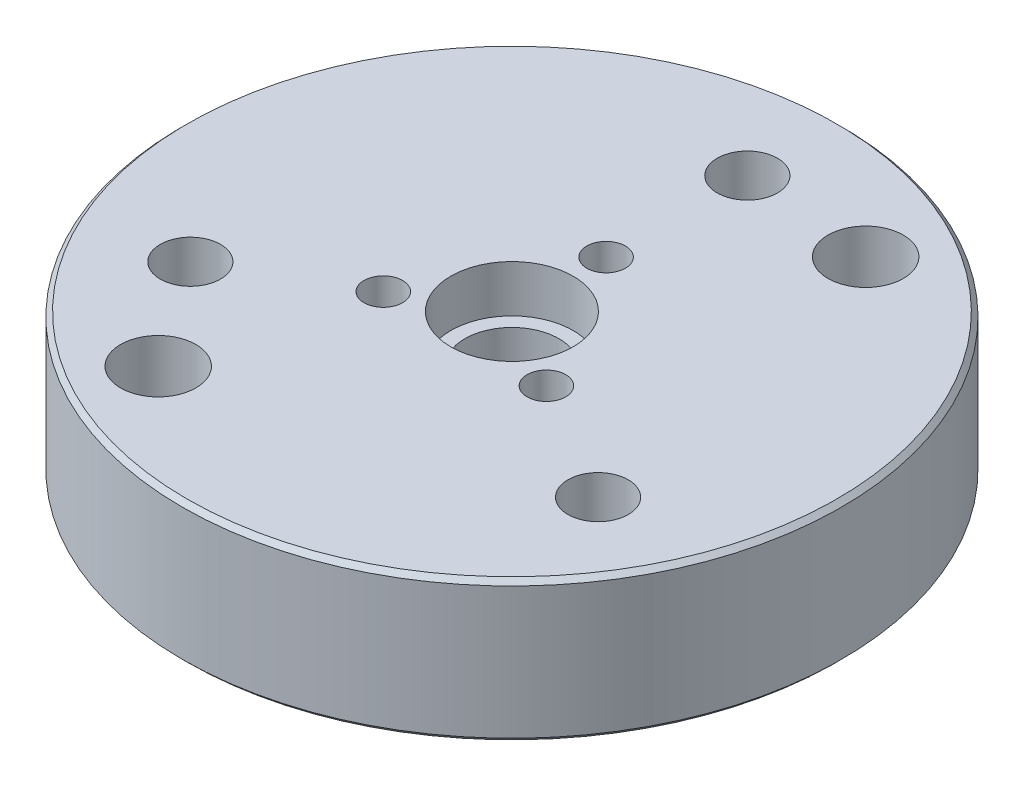
ISO-10303-21;
HEADER;
FILE_DESCRIPTION(('STEP AP214'),'2;1');
FILE_NAME('part.step','',(''),(''),'','','');
FILE_SCHEMA(('AUTOMOTIVE_DESIGN { 1 0 10303 214 1 1 1 1 }'));
ENDSEC;
DATA;
#1=APPLICATION_CONTEXT('core data for automotive mechanical design processes');
#2=APPLICATION_PROTOCOL_DEFINITION('international standard','automotive_design',2000,#1);
#3=PRODUCT_CONTEXT('',#1,'mechanical');
#4=PRODUCT('Part','Part','',(#3));
#5=PRODUCT_RELATED_PRODUCT_CATEGORY('part','',(#4));
#6=PRODUCT_DEFINITION_FORMATION('','',#4);
#7=PRODUCT_DEFINITION_CONTEXT('part definition',#1,'design');
#8=PRODUCT_DEFINITION('design','',#6,#7);
#9=PRODUCT_DEFINITION_SHAPE('','',#8);
#10=(LENGTH_UNIT() NAMED_UNIT(*) SI_UNIT(.MILLI.,.METRE.));
#11=(NAMED_UNIT(*) PLANE_ANGLE_UNIT() SI_UNIT($,.RADIAN.));
#12=(NAMED_UNIT(*) SI_UNIT($,.STERADIAN.) SOLID_ANGLE_UNIT());
#13=UNCERTAINTY_MEASURE_WITH_UNIT(LENGTH_MEASURE(1.E-05),#10,'distance_accuracy_value','');
#14=(GEOMETRIC_REPRESENTATION_CONTEXT(3) GLOBAL_UNCERTAINTY_ASSIGNED_CONTEXT((#13)) GLOBAL_UNIT_ASSIGNED_CONTEXT((#10,
#11,#12)) REPRESENTATION_CONTEXT('',''));
#15=CARTESIAN_POINT('',(0.,0.,0.));
#16=DIRECTION('',(0.,0.,1.));
#17=DIRECTION('',(1.,0.,0.));
#18=AXIS2_PLACEMENT_3D('',#15,#16,#17);
#19=CARTESIAN_POINT('',(0.,-0.000999999999999265,0.));
#20=DIRECTION('',(0.,1.,0.));
#21=DIRECTION('',(0.,0.,1.));
#22=AXIS2_PLACEMENT_3D('',#19,#20,#21);
#23=CYLINDRICAL_SURFACE('',#22,5.);
#24=CARTESIAN_POINT('',(0.,0.,0.));
#25=DIRECTION('',(0.,1.,0.));
#26=DIRECTION('',(0.,0.,1.));
#27=AXIS2_PLACEMENT_3D('',#24,#25,#26);
#28=CIRCLE('',#27,5.);
#29=CARTESIAN_POINT('',(0.,0.,5.));
#30=VERTEX_POINT('',#29);
#31=EDGE_CURVE('E82',#30,#30,#28,.F.);
#32=CARTESIAN_POINT('',(0.,10.,0.));
#33=DIRECTION('',(0.,1.,0.));
#34=DIRECTION('',(0.,0.,1.));
#35=AXIS2_PLACEMENT_3D('',#32,#33,#34);
#36=CIRCLE('',#35,5.);
#37=CARTESIAN_POINT('',(0.,10.,5.));
#38=VERTEX_POINT('',#37);
#39=EDGE_CURVE('E83',#38,#38,#36,.F.);
#40=CARTESIAN_POINT('',(0.,0.,5.));
#41=CARTESIAN_POINT('',(0.,0.104166666666667,5.));
#42=CARTESIAN_POINT('',(0.,0.208333333333333,5.));
#43=CARTESIAN_POINT('',(0.,0.416666666666667,5.));
#44=CARTESIAN_POINT('',(0.,0.520833333333333,5.));
#45=CARTESIAN_POINT('',(0.,0.729166666666667,5.));
#46=CARTESIAN_POINT('',(0.,0.833333333333333,5.));
#47=CARTESIAN_POINT('',(0.,1.04166666666667,5.));
#48=CARTESIAN_POINT('',(0.,1.14583333333333,5.));
#49=CARTESIAN_POINT('',(0.,1.35416666666667,5.));
#50=CARTESIAN_POINT('',(0.,1.45833333333333,5.));
#51=CARTESIAN_POINT('',(0.,1.66666666666667,5.));
#52=CARTESIAN_POINT('',(0.,1.77083333333333,5.));
#53=CARTESIAN_POINT('',(0.,1.97916666666667,5.));
#54=CARTESIAN_POINT('',(0.,2.08333333333333,5.));
#55=CARTESIAN_POINT('',(0.,2.29166666666667,5.));
#56=CARTESIAN_POINT('',(0.,2.39583333333333,5.));
#57=CARTESIAN_POINT('',(0.,2.60416666666667,5.));
#58=CARTESIAN_POINT('',(0.,2.70833333333333,5.));
#59=CARTESIAN_POINT('',(0.,2.91666666666667,5.));
#60=CARTESIAN_POINT('',(0.,3.02083333333333,5.));
#61=CARTESIAN_POINT('',(0.,3.22916666666667,5.));
#62=CARTESIAN_POINT('',(0.,3.33333333333333,5.));
#63=CARTESIAN_POINT('',(0.,3.54166666666667,5.));
#64=CARTESIAN_POINT('',(0.,3.64583333333333,5.));
#65=CARTESIAN_POINT('',(0.,3.85416666666667,5.));
#66=CARTESIAN_POINT('',(0.,3.95833333333333,5.));
#67=CARTESIAN_POINT('',(0.,4.16666666666667,5.));
#68=CARTESIAN_POINT('',(0.,4.27083333333333,5.));
#69=CARTESIAN_POINT('',(0.,4.47916666666667,5.));
#70=CARTESIAN_POINT('',(0.,4.58333333333333,5.));
#71=CARTESIAN_POINT('',(0.,4.79166666666667,5.));
#72=CARTESIAN_POINT('',(0.,4.89583333333333,5.));
#73=CARTESIAN_POINT('',(0.,5.10416666666667,5.));
#74=CARTESIAN_POINT('',(0.,5.20833333333333,5.));
#75=CARTESIAN_POINT('',(0.,5.41666666666667,5.));
#76=CARTESIAN_POINT('',(0.,5.52083333333333,5.));
#77=CARTESIAN_POINT('',(0.,5.72916666666667,5.));
#78=CARTESIAN_POINT('',(0.,5.83333333333333,5.));
#79=CARTESIAN_POINT('',(0.,6.04166666666667,5.));
#80=CARTESIAN_POINT('',(0.,6.14583333333333,5.));
#81=CARTESIAN_POINT('',(0.,6.35416666666667,5.));
#82=CARTESIAN_POINT('',(0.,6.45833333333333,5.));
#83=CARTESIAN_POINT('',(0.,6.66666666666667,5.));
#84=CARTESIAN_POINT('',(0.,6.77083333333333,5.));
#85=CARTESIAN_POINT('',(0.,6.97916666666667,5.));
#86=CARTESIAN_POINT('',(0.,7.08333333333333,5.));
#87=CARTESIAN_POINT('',(0.,7.29166666666667,5.));
#88=CARTESIAN_POINT('',(0.,7.39583333333333,5.));
#89=CARTESIAN_POINT('',(0.,7.60416666666667,5.));
#90=CARTESIAN_POINT('',(0.,7.70833333333333,5.));
#91=CARTESIAN_POINT('',(0.,7.91666666666667,5.));
#92=CARTESIAN_POINT('',(0.,8.02083333333333,5.));
#93=CARTESIAN_POINT('',(0.,8.22916666666667,5.));
#94=CARTESIAN_POINT('',(0.,8.33333333333333,5.));
#95=CARTESIAN_POINT('',(0.,8.54166666666667,5.));
#96=CARTESIAN_POINT('',(0.,8.64583333333333,5.));
#97=CARTESIAN_POINT('',(0.,8.85416666666666,5.));
#98=CARTESIAN_POINT('',(0.,8.95833333333333,5.));
#99=CARTESIAN_POINT('',(0.,9.16666666666666,5.));
#100=CARTESIAN_POINT('',(0.,9.27083333333333,5.));
#101=CARTESIAN_POINT('',(0.,9.47916666666667,5.));
#102=CARTESIAN_POINT('',(0.,9.58333333333333,5.));
#103=CARTESIAN_POINT('',(0.,9.79166666666667,5.));
#104=CARTESIAN_POINT('',(0.,9.89583333333333,5.));
#105=CARTESIAN_POINT('',(0.,10.,5.));
#106=B_SPLINE_CURVE_WITH_KNOTS('',3,(#40,#41,#42,#43,#44,#45,#46,#47,#48,#49,#50,#51,#52,#53,
#54,#55,#56,#57,#58,#59,#60,#61,#62,#63,#64,#65,#66,#67,#68,#69,#70,#71,#72,#73,#74,#75,#76,#77,
#78,#79,#80,#81,#82,#83,#84,#85,#86,#87,#88,#89,#90,#91,#92,#93,#94,#95,#96,#97,#98,#99,#100,
#101,#102,#103,#104,#105),.UNSPECIFIED.,.F.,.F.,(4,2,2,2,2,2,2,2,2,2,2,2,2,2,2,2,2,2,2,2,2,2,2,
2,2,2,2,2,2,2,2,2,4),(0.,0.3125,0.625,0.9375,1.25,1.5625,1.875,2.1875,2.5,2.8125,3.125,3.4375,
3.75,4.0625,4.375,4.6875,5.,5.3125,5.625,5.9375,6.25,6.5625,6.875,7.1875,7.5,7.8125,8.125,
8.4375,8.75,9.0625,9.375,9.6875,10.),.UNSPECIFIED.);
#107=EDGE_CURVE('BSEAM55',#30,#38,#106,.T.);
#108=ORIENTED_EDGE('',*,*,#31,.T.);
#109=ORIENTED_EDGE('',*,*,#39,.F.);
#110=ORIENTED_EDGE('',*,*,#107,.T.);
#111=ORIENTED_EDGE('',*,*,#107,.F.);
#112=EDGE_LOOP('',(#108,#110,#109,#111));
#113=FACE_BOUND('',#112,.T.);
#114=ADVANCED_FACE('F55',(#113),#23,.F.);
#115=CARTESIAN_POINT('',(0.,15.,0.));
#116=DIRECTION('',(0.,-1.,0.));
#117=DIRECTION('',(0.,0.,-1.));
#118=AXIS2_PLACEMENT_3D('',#115,#116,#117);
#119=CYLINDRICAL_SURFACE('',#118,35.);
#120=CARTESIAN_POINT('',(0.,0.500000000000014,0.));
#121=DIRECTION('',(0.,1.,0.));
#122=DIRECTION('',(0.,0.,1.));
#123=AXIS2_PLACEMENT_3D('',#120,#121,#122);
#124=CIRCLE('',#123,35.);
#125=CARTESIAN_POINT('',(0.,0.500000000000014,35.));
#126=VERTEX_POINT('',#125);
#127=EDGE_CURVE('E70',#126,#126,#124,.T.);
#128=ORIENTED_EDGE('',*,*,#127,.T.);
#129=EDGE_LOOP('',(#128));
#130=FACE_BOUND('',#129,.T.);
#131=CARTESIAN_POINT('',(0.,14.5,0.));
#132=DIRECTION('',(0.,1.,0.));
#133=DIRECTION('',(0.,0.,1.));
#134=AXIS2_PLACEMENT_3D('',#131,#132,#133);
#135=CIRCLE('',#134,35.);
#136=CARTESIAN_POINT('',(0.,14.5,35.));
#137=VERTEX_POINT('',#136);
#138=EDGE_CURVE('E76',#137,#137,#135,.F.);
#139=ORIENTED_EDGE('',*,*,#138,.T.);
#140=EDGE_LOOP('',(#139));
#141=FACE_BOUND('',#140,.T.);
#142=ADVANCED_FACE('F190',(#130,#141),#119,.T.);
#143=CARTESIAN_POINT('',(0.,15.,0.));
#144=DIRECTION('',(0.,1.,0.));
#145=DIRECTION('',(0.,0.,1.));
#146=AXIS2_PLACEMENT_3D('',#143,#144,#145);
#147=PLANE('',#146);
#148=CARTESIAN_POINT('',(0.,15.,0.));
#149=DIRECTION('',(0.,1.,0.));
#150=DIRECTION('',(0.,0.,1.));
#151=AXIS2_PLACEMENT_3D('',#148,#149,#150);
#152=CIRCLE('',#151,34.5);
#153=CARTESIAN_POINT('',(0.,15.,34.5));
#154=VERTEX_POINT('',#153);
#155=EDGE_CURVE('E12',#154,#154,#152,.T.);
#156=ORIENTED_EDGE('',*,*,#155,.T.);
#157=EDGE_LOOP('',(#156));
#158=FACE_BOUND('',#157,.T.);
#159=CARTESIAN_POINT('',(13.75,15.,-23.815698604072));
#160=DIRECTION('',(0.,-1.,0.));
#161=DIRECTION('',(0.,0.,-1.));
#162=AXIS2_PLACEMENT_3D('',#159,#160,#161);
#163=CIRCLE('',#162,4.);
#164=CARTESIAN_POINT('',(13.75,15.,-27.815698604072));
#165=VERTEX_POINT('',#164);
#166=EDGE_CURVE('E154',#165,#165,#163,.T.);
#167=ORIENTED_EDGE('',*,*,#166,.T.);
#168=EDGE_LOOP('',(#167));
#169=FACE_BOUND('',#168,.T.);
#170=CARTESIAN_POINT('',(-13.75,15.,23.815698604072));
#171=DIRECTION('',(0.,-1.,0.));
#172=DIRECTION('',(0.,0.,-1.));
#173=AXIS2_PLACEMENT_3D('',#170,#171,#172);
#174=CIRCLE('',#173,4.);
#175=CARTESIAN_POINT('',(-13.75,15.,19.8156986040721));
#176=VERTEX_POINT('',#175);
#177=EDGE_CURVE('E146',#176,#176,#174,.T.);
#178=ORIENTED_EDGE('',*,*,#177,.T.);
#179=EDGE_LOOP('',(#178));
#180=FACE_BOUND('',#179,.T.);
#181=CARTESIAN_POINT('',(0.,15.,-25.));
#182=DIRECTION('',(0.,-1.,0.));
#183=DIRECTION('',(0.,0.,-1.));
#184=AXIS2_PLACEMENT_3D('',#181,#182,#183);
#185=CIRCLE('',#184,3.2);
#186=CARTESIAN_POINT('',(0.,15.,-28.2));
#187=VERTEX_POINT('',#186);
#188=EDGE_CURVE('E138',#187,#187,#185,.T.);
#189=ORIENTED_EDGE('',*,*,#188,.T.);
#190=EDGE_LOOP('',(#189));
#191=FACE_BOUND('',#190,.T.);
#192=CARTESIAN_POINT('',(-21.650635094611,15.,12.4999999999999));
#193=DIRECTION('',(0.,-1.,0.));
#194=DIRECTION('',(0.,0.,-1.));
#195=AXIS2_PLACEMENT_3D('',#192,#193,#194);
#196=CIRCLE('',#195,3.2);
#197=CARTESIAN_POINT('',(-21.650635094611,15.,9.29999999999995));
#198=VERTEX_POINT('',#197);
#199=EDGE_CURVE('E130',#198,#198,#196,.T.);
#200=ORIENTED_EDGE('',*,*,#199,.T.);
#201=EDGE_LOOP('',(#200));
#202=FACE_BOUND('',#201,.T.);
#203=CARTESIAN_POINT('',(21.650635094611,15.,12.5));
#204=DIRECTION('',(0.,-1.,0.));
#205=DIRECTION('',(0.,0.,-1.));
#206=AXIS2_PLACEMENT_3D('',#203,#204,#205);
#207=CIRCLE('',#206,3.2);
#208=CARTESIAN_POINT('',(21.650635094611,15.,9.29999999999996));
#209=VERTEX_POINT('',#208);
#210=EDGE_CURVE('E108',#209,#209,#207,.T.);
#211=ORIENTED_EDGE('',*,*,#210,.T.);
#212=EDGE_LOOP('',(#211));
#213=FACE_BOUND('',#212,.T.);
#214=CARTESIAN_POINT('',(0.,15.,-10.));
#215=DIRECTION('',(0.,1.,0.));
#216=DIRECTION('',(0.,0.,1.));
#217=AXIS2_PLACEMENT_3D('',#214,#215,#216);
#218=CIRCLE('',#217,2.04999999999999);
#219=CARTESIAN_POINT('',(0.,15.,-7.95000000000001));
#220=VERTEX_POINT('',#219);
#221=EDGE_CURVE('E113',#220,#220,#218,.T.);
#222=ORIENTED_EDGE('',*,*,#221,.F.);
#223=EDGE_LOOP('',(#222));
#224=FACE_BOUND('',#223,.T.);
#225=CARTESIAN_POINT('',(8.6602540378444,15.,4.99999999999998));
#226=DIRECTION('',(0.,1.,0.));
#227=DIRECTION('',(0.,0.,1.));
#228=AXIS2_PLACEMENT_3D('',#225,#226,#227);
#229=CIRCLE('',#228,2.04999999999999);
#230=CARTESIAN_POINT('',(8.6602540378444,15.,7.04999999999997));
#231=VERTEX_POINT('',#230);
#232=EDGE_CURVE('E109',#231,#231,#229,.T.);
#233=ORIENTED_EDGE('',*,*,#232,.F.);
#234=EDGE_LOOP('',(#233));
#235=FACE_BOUND('',#234,.T.);
#236=CARTESIAN_POINT('',(-8.6602540378444,15.,4.99999999999998));
#237=DIRECTION('',(0.,1.,0.));
#238=DIRECTION('',(0.,0.,1.));
#239=AXIS2_PLACEMENT_3D('',#236,#237,#238);
#240=CIRCLE('',#239,2.04999999999999);
#241=CARTESIAN_POINT('',(-8.6602540378444,15.,7.04999999999997));
#242=VERTEX_POINT('',#241);
#243=EDGE_CURVE('E99',#242,#242,#240,.T.);
#244=ORIENTED_EDGE('',*,*,#243,.F.);
#245=EDGE_LOOP('',(#244));
#246=FACE_BOUND('',#245,.T.);
#247=CARTESIAN_POINT('',(0.,15.,0.));
#248=DIRECTION('',(0.,1.,0.));
#249=DIRECTION('',(0.,0.,1.));
#250=AXIS2_PLACEMENT_3D('',#247,#248,#249);
#251=CIRCLE('',#250,6.5);
#252=CARTESIAN_POINT('',(0.,15.,6.5));
#253=VERTEX_POINT('',#252);
#254=EDGE_CURVE('E91',#253,#253,#251,.T.);
#255=ORIENTED_EDGE('',*,*,#254,.F.);
#256=EDGE_LOOP('',(#255));
#257=FACE_BOUND('',#256,.T.);
#258=ADVANCED_FACE('F170',(#158,#169,#180,#191,#202,#213,#224,#235,#246,#257),#147,.T.);
#259=CARTESIAN_POINT('',(0.,0.,0.));
#260=DIRECTION('',(0.,1.,0.));
#261=DIRECTION('',(0.,0.,1.));
#262=AXIS2_PLACEMENT_3D('',#259,#260,#261);
#263=PLANE('',#262);
#264=CARTESIAN_POINT('',(0.,0.,0.));
#265=DIRECTION('',(0.,1.,0.));
#266=DIRECTION('',(0.,0.,1.));
#267=AXIS2_PLACEMENT_3D('',#264,#265,#266);
#268=CIRCLE('',#267,34.5);
#269=CARTESIAN_POINT('',(0.,0.,34.5));
#270=VERTEX_POINT('',#269);
#271=EDGE_CURVE('E64',#270,#270,#268,.F.);
#272=ORIENTED_EDGE('',*,*,#271,.T.);
#273=EDGE_LOOP('',(#272));
#274=FACE_BOUND('',#273,.T.);
#275=CARTESIAN_POINT('',(13.75,0.,-23.815698604072));
#276=DIRECTION('',(0.,-1.,0.));
#277=DIRECTION('',(0.,0.,-1.));
#278=AXIS2_PLACEMENT_3D('',#275,#276,#277);
#279=CIRCLE('',#278,4.);
#280=CARTESIAN_POINT('',(13.75,0.,-27.815698604072));
#281=VERTEX_POINT('',#280);
#282=EDGE_CURVE('E158',#281,#281,#279,.T.);
#283=ORIENTED_EDGE('',*,*,#282,.F.);
#284=EDGE_LOOP('',(#283));
#285=FACE_BOUND('',#284,.T.);
#286=CARTESIAN_POINT('',(-13.75,0.,23.815698604072));
#287=DIRECTION('',(0.,-1.,0.));
#288=DIRECTION('',(0.,0.,-1.));
#289=AXIS2_PLACEMENT_3D('',#286,#287,#288);
#290=CIRCLE('',#289,4.);
#291=CARTESIAN_POINT('',(-13.75,0.,19.8156986040721));
#292=VERTEX_POINT('',#291);
#293=EDGE_CURVE('E150',#292,#292,#290,.T.);
#294=ORIENTED_EDGE('',*,*,#293,.F.);
#295=EDGE_LOOP('',(#294));
#296=FACE_BOUND('',#295,.T.);
#297=CARTESIAN_POINT('',(0.,0.,-25.));
#298=DIRECTION('',(0.,-1.,0.));
#299=DIRECTION('',(0.,0.,-1.));
#300=AXIS2_PLACEMENT_3D('',#297,#298,#299);
#301=CIRCLE('',#300,3.2);
#302=CARTESIAN_POINT('',(0.,0.,-28.2));
#303=VERTEX_POINT('',#302);
#304=EDGE_CURVE('E142',#303,#303,#301,.T.);
#305=ORIENTED_EDGE('',*,*,#304,.F.);
#306=EDGE_LOOP('',(#305));
#307=FACE_BOUND('',#306,.T.);
#308=CARTESIAN_POINT('',(-21.650635094611,0.,12.4999999999999));
#309=DIRECTION('',(0.,-1.,0.));
#310=DIRECTION('',(0.,0.,-1.));
#311=AXIS2_PLACEMENT_3D('',#308,#309,#310);
#312=CIRCLE('',#311,3.2);
#313=CARTESIAN_POINT('',(-21.650635094611,0.,9.29999999999995));
#314=VERTEX_POINT('',#313);
#315=EDGE_CURVE('E134',#314,#314,#312,.T.);
#316=ORIENTED_EDGE('',*,*,#315,.F.);
#317=EDGE_LOOP('',(#316));
#318=FACE_BOUND('',#317,.T.);
#319=CARTESIAN_POINT('',(21.650635094611,0.,12.5));
#320=DIRECTION('',(0.,-1.,0.));
#321=DIRECTION('',(0.,0.,-1.));
#322=AXIS2_PLACEMENT_3D('',#319,#320,#321);
#323=CIRCLE('',#322,3.2);
#324=CARTESIAN_POINT('',(21.650635094611,0.,9.29999999999996));
#325=VERTEX_POINT('',#324);
#326=EDGE_CURVE('E126',#325,#325,#323,.T.);
#327=ORIENTED_EDGE('',*,*,#326,.F.);
#328=EDGE_LOOP('',(#327));
#329=FACE_BOUND('',#328,.T.);
#330=CARTESIAN_POINT('',(0.,0.,-10.));
#331=DIRECTION('',(0.,1.,0.));
#332=DIRECTION('',(0.,0.,1.));
#333=AXIS2_PLACEMENT_3D('',#330,#331,#332);
#334=CIRCLE('',#333,2.04999999999999);
#335=CARTESIAN_POINT('',(0.,0.,-7.95000000000001));
#336=VERTEX_POINT('',#335);
#337=EDGE_CURVE('E95',#336,#336,#334,.F.);
#338=ORIENTED_EDGE('',*,*,#337,.F.);
#339=EDGE_LOOP('',(#338));
#340=FACE_BOUND('',#339,.T.);
#341=CARTESIAN_POINT('',(8.6602540378444,0.,4.99999999999998));
#342=DIRECTION('',(0.,1.,0.));
#343=DIRECTION('',(0.,0.,1.));
#344=AXIS2_PLACEMENT_3D('',#341,#342,#343);
#345=CIRCLE('',#344,2.04999999999999);
#346=CARTESIAN_POINT('',(8.6602540378444,0.,7.04999999999997));
#347=VERTEX_POINT('',#346);
#348=EDGE_CURVE('E103',#347,#347,#345,.F.);
#349=ORIENTED_EDGE('',*,*,#348,.F.);
#350=EDGE_LOOP('',(#349));
#351=FACE_BOUND('',#350,.T.);
#352=CARTESIAN_POINT('',(-8.6602540378444,0.,4.99999999999998));
#353=DIRECTION('',(0.,1.,0.));
#354=DIRECTION('',(0.,0.,1.));
#355=AXIS2_PLACEMENT_3D('',#352,#353,#354);
#356=CIRCLE('',#355,2.04999999999999);
#357=CARTESIAN_POINT('',(-8.6602540378444,0.,7.04999999999997));
#358=VERTEX_POINT('',#357);
#359=EDGE_CURVE('E104',#358,#358,#356,.F.);
#360=ORIENTED_EDGE('',*,*,#359,.F.);
#361=EDGE_LOOP('',(#360));
#362=FACE_BOUND('',#361,.T.);
#363=ORIENTED_EDGE('',*,*,#31,.F.);
#364=EDGE_LOOP('',(#363));
#365=FACE_BOUND('',#364,.T.);
#366=ADVANCED_FACE('F166',(#274,#285,#296,#307,#318,#329,#340,#351,#362,#365),#263,.F.);
#367=CARTESIAN_POINT('',(0.,10.,0.));
#368=DIRECTION('',(0.,1.,0.));
#369=DIRECTION('',(0.,0.,1.));
#370=AXIS2_PLACEMENT_3D('',#367,#368,#369);
#371=PLANE('',#370);
#372=CARTESIAN_POINT('',(0.,10.,0.));
#373=DIRECTION('',(0.,1.,0.));
#374=DIRECTION('',(0.,0.,1.));
#375=AXIS2_PLACEMENT_3D('',#372,#373,#374);
#376=CIRCLE('',#375,6.5);
#377=CARTESIAN_POINT('',(0.,10.,6.5));
#378=VERTEX_POINT('',#377);
#379=EDGE_CURVE('E87',#378,#378,#376,.T.);
#380=ORIENTED_EDGE('',*,*,#379,.T.);
#381=EDGE_LOOP('',(#380));
#382=FACE_BOUND('',#381,.T.);
#383=ORIENTED_EDGE('',*,*,#39,.T.);
#384=EDGE_LOOP('',(#383));
#385=FACE_BOUND('',#384,.T.);
#386=ADVANCED_FACE('F169',(#382,#385),#371,.T.);
#387=CARTESIAN_POINT('',(0.,10.,0.));
#388=DIRECTION('',(0.,1.,0.));
#389=DIRECTION('',(0.,0.,1.));
#390=AXIS2_PLACEMENT_3D('',#387,#388,#389);
#391=CYLINDRICAL_SURFACE('',#390,6.5);
#392=ORIENTED_EDGE('',*,*,#379,.F.);
#393=EDGE_LOOP('',(#392));
#394=FACE_BOUND('',#393,.T.);
#395=ORIENTED_EDGE('',*,*,#254,.T.);
#396=EDGE_LOOP('',(#395));
#397=FACE_BOUND('',#396,.T.);
#398=ADVANCED_FACE('F195',(#394,#397),#391,.F.);
#399=CARTESIAN_POINT('',(-8.6602540378444,-0.000999999999999265,4.99999999999998));
#400=DIRECTION('',(0.,1.,0.));
#401=DIRECTION('',(0.,0.,1.));
#402=AXIS2_PLACEMENT_3D('',#399,#400,#401);
#403=CYLINDRICAL_SURFACE('',#402,2.04999999999999);
#404=CARTESIAN_POINT('',(-8.6602540378444,15.,7.04999999999997));
#405=CARTESIAN_POINT('',(-8.6602540378444,14.84375,7.04999999999997));
#406=CARTESIAN_POINT('',(-8.6602540378444,14.6875,7.04999999999997));
#407=CARTESIAN_POINT('',(-8.6602540378444,14.375,7.04999999999997));
#408=CARTESIAN_POINT('',(-8.6602540378444,14.21875,7.04999999999997));
#409=CARTESIAN_POINT('',(-8.6602540378444,13.90625,7.04999999999997));
#410=CARTESIAN_POINT('',(-8.6602540378444,13.75,7.04999999999997));
#411=CARTESIAN_POINT('',(-8.6602540378444,13.4375,7.04999999999997));
#412=CARTESIAN_POINT('',(-8.6602540378444,13.28125,7.04999999999997));
#413=CARTESIAN_POINT('',(-8.6602540378444,12.96875,7.04999999999997));
#414=CARTESIAN_POINT('',(-8.6602540378444,12.8125,7.04999999999997));
#415=CARTESIAN_POINT('',(-8.6602540378444,12.5,7.04999999999997));
#416=CARTESIAN_POINT('',(-8.6602540378444,12.34375,7.04999999999997));
#417=CARTESIAN_POINT('',(-8.6602540378444,12.03125,7.04999999999997));
#418=CARTESIAN_POINT('',(-8.6602540378444,11.875,7.04999999999997));
#419=CARTESIAN_POINT('',(-8.6602540378444,11.5625,7.04999999999997));
#420=CARTESIAN_POINT('',(-8.6602540378444,11.40625,7.04999999999997));
#421=CARTESIAN_POINT('',(-8.6602540378444,11.09375,7.04999999999997));
#422=CARTESIAN_POINT('',(-8.6602540378444,10.9375,7.04999999999997));
#423=CARTESIAN_POINT('',(-8.6602540378444,10.625,7.04999999999997));
#424=CARTESIAN_POINT('',(-8.6602540378444,10.46875,7.04999999999997));
#425=CARTESIAN_POINT('',(-8.6602540378444,10.15625,7.04999999999997));
#426=CARTESIAN_POINT('',(-8.6602540378444,10.,7.04999999999997));
#427=CARTESIAN_POINT('',(-8.6602540378444,9.6875,7.04999999999997));
#428=CARTESIAN_POINT('',(-8.6602540378444,9.53125,7.04999999999997));
#429=CARTESIAN_POINT('',(-8.6602540378444,9.21875,7.04999999999997));
#430=CARTESIAN_POINT('',(-8.6602540378444,9.0625,7.04999999999997));
#431=CARTESIAN_POINT('',(-8.6602540378444,8.75,7.04999999999997));
#432=CARTESIAN_POINT('',(-8.6602540378444,8.59375,7.04999999999997));
#433=CARTESIAN_POINT('',(-8.6602540378444,8.28125,7.04999999999997));
#434=CARTESIAN_POINT('',(-8.6602540378444,8.125,7.04999999999997));
#435=CARTESIAN_POINT('',(-8.6602540378444,7.8125,7.04999999999997));
#436=CARTESIAN_POINT('',(-8.6602540378444,7.65625,7.04999999999997));
#437=CARTESIAN_POINT('',(-8.6602540378444,7.34375,7.04999999999997));
#438=CARTESIAN_POINT('',(-8.6602540378444,7.1875,7.04999999999997));
#439=CARTESIAN_POINT('',(-8.6602540378444,6.875,7.04999999999997));
#440=CARTESIAN_POINT('',(-8.6602540378444,6.71875,7.04999999999997));
#441=CARTESIAN_POINT('',(-8.6602540378444,6.40625,7.04999999999997));
#442=CARTESIAN_POINT('',(-8.6602540378444,6.25,7.04999999999997));
#443=CARTESIAN_POINT('',(-8.6602540378444,5.9375,7.04999999999997));
#444=CARTESIAN_POINT('',(-8.6602540378444,5.78125,7.04999999999997));
#445=CARTESIAN_POINT('',(-8.6602540378444,5.46875,7.04999999999997));
#446=CARTESIAN_POINT('',(-8.6602540378444,5.3125,7.04999999999997));
#447=CARTESIAN_POINT('',(-8.6602540378444,5.,7.04999999999997));
#448=CARTESIAN_POINT('',(-8.6602540378444,4.84375,7.04999999999997));
#449=CARTESIAN_POINT('',(-8.6602540378444,4.53125,7.04999999999997));
#450=CARTESIAN_POINT('',(-8.6602540378444,4.375,7.04999999999997));
#451=CARTESIAN_POINT('',(-8.6602540378444,4.0625,7.04999999999997));
#452=CARTESIAN_POINT('',(-8.6602540378444,3.90625,7.04999999999997));
#453=CARTESIAN_POINT('',(-8.6602540378444,3.59375,7.04999999999997));
#454=CARTESIAN_POINT('',(-8.6602540378444,3.4375,7.04999999999997));
#455=CARTESIAN_POINT('',(-8.6602540378444,3.125,7.04999999999997));
#456=CARTESIAN_POINT('',(-8.6602540378444,2.96875,7.04999999999997));
#457=CARTESIAN_POINT('',(-8.6602540378444,2.65625,7.04999999999997));
#458=CARTESIAN_POINT('',(-8.6602540378444,2.5,7.04999999999997));
#459=CARTESIAN_POINT('',(-8.6602540378444,2.1875,7.04999999999997));
#460=CARTESIAN_POINT('',(-8.6602540378444,2.03125,7.04999999999997));
#461=CARTESIAN_POINT('',(-8.6602540378444,1.71875,7.04999999999997));
#462=CARTESIAN_POINT('',(-8.6602540378444,1.5625,7.04999999999997));
#463=CARTESIAN_POINT('',(-8.6602540378444,1.25,7.04999999999997));
#464=CARTESIAN_POINT('',(-8.6602540378444,1.09375,7.04999999999997));
#465=CARTESIAN_POINT('',(-8.6602540378444,0.781250000000001,7.04999999999997));
#466=CARTESIAN_POINT('',(-8.6602540378444,0.625,7.04999999999997));
#467=CARTESIAN_POINT('',(-8.6602540378444,0.3125,7.04999999999997));
#468=CARTESIAN_POINT('',(-8.6602540378444,0.15625,7.04999999999997));
#469=CARTESIAN_POINT('',(-8.6602540378444,0.,7.04999999999997));
#470=B_SPLINE_CURVE_WITH_KNOTS('',3,(#404,#405,#406,#407,#408,#409,#410,#411,#412,#413,#414,
#415,#416,#417,#418,#419,#420,#421,#422,#423,#424,#425,#426,#427,#428,#429,#430,#431,#432,#433,
#434,#435,#436,#437,#438,#439,#440,#441,#442,#443,#444,#445,#446,#447,#448,#449,#450,#451,#452,
#453,#454,#455,#456,#457,#458,#459,#460,#461,#462,#463,#464,#465,#466,#467,#468,#469),
.UNSPECIFIED.,.F.,.F.,(4,2,2,2,2,2,2,2,2,2,2,2,2,2,2,2,2,2,2,2,2,2,2,2,2,2,2,2,2,2,2,2,4),(0.,
0.46875,0.937500000000001,1.40625,1.875,2.34375,2.8125,3.28125,3.75,4.21875,4.6875,5.15625,
5.625,6.09375,6.5625,7.03125,7.5,7.96875,8.4375,8.90625,9.375,9.84375,10.3125,10.78125,11.25,
11.71875,12.1875,12.65625,13.125,13.59375,14.0625,14.53125,15.),.UNSPECIFIED.);
#471=EDGE_CURVE('BSEAM201',#242,#358,#470,.T.);
#472=ORIENTED_EDGE('',*,*,#243,.T.);
#473=ORIENTED_EDGE('',*,*,#359,.T.);
#474=ORIENTED_EDGE('',*,*,#471,.T.);
#475=ORIENTED_EDGE('',*,*,#471,.F.);
#476=EDGE_LOOP('',(#472,#474,#473,#475));
#477=FACE_BOUND('',#476,.T.);
#478=ADVANCED_FACE('F201',(#477),#403,.F.);
#479=CARTESIAN_POINT('',(8.6602540378444,-0.000999999999999265,4.99999999999998));
#480=DIRECTION('',(0.,1.,0.));
#481=DIRECTION('',(0.,0.,1.));
#482=AXIS2_PLACEMENT_3D('',#479,#480,#481);
#483=CYLINDRICAL_SURFACE('',#482,2.04999999999999);
#484=CARTESIAN_POINT('',(8.6602540378444,15.,7.04999999999997));
#485=CARTESIAN_POINT('',(8.6602540378444,14.84375,7.04999999999997));
#486=CARTESIAN_POINT('',(8.6602540378444,14.6875,7.04999999999997));
#487=CARTESIAN_POINT('',(8.6602540378444,14.375,7.04999999999997));
#488=CARTESIAN_POINT('',(8.6602540378444,14.21875,7.04999999999997));
#489=CARTESIAN_POINT('',(8.6602540378444,13.90625,7.04999999999997));
#490=CARTESIAN_POINT('',(8.6602540378444,13.75,7.04999999999997));
#491=CARTESIAN_POINT('',(8.6602540378444,13.4375,7.04999999999997));
#492=CARTESIAN_POINT('',(8.6602540378444,13.28125,7.04999999999997));
#493=CARTESIAN_POINT('',(8.6602540378444,12.96875,7.04999999999997));
#494=CARTESIAN_POINT('',(8.6602540378444,12.8125,7.04999999999997));
#495=CARTESIAN_POINT('',(8.6602540378444,12.5,7.04999999999997));
#496=CARTESIAN_POINT('',(8.6602540378444,12.34375,7.04999999999997));
#497=CARTESIAN_POINT('',(8.6602540378444,12.03125,7.04999999999997));
#498=CARTESIAN_POINT('',(8.6602540378444,11.875,7.04999999999997));
#499=CARTESIAN_POINT('',(8.6602540378444,11.5625,7.04999999999997));
#500=CARTESIAN_POINT('',(8.6602540378444,11.40625,7.04999999999997));
#501=CARTESIAN_POINT('',(8.6602540378444,11.09375,7.04999999999997));
#502=CARTESIAN_POINT('',(8.6602540378444,10.9375,7.04999999999997));
#503=CARTESIAN_POINT('',(8.6602540378444,10.625,7.04999999999997));
#504=CARTESIAN_POINT('',(8.6602540378444,10.46875,7.04999999999997));
#505=CARTESIAN_POINT('',(8.6602540378444,10.15625,7.04999999999997));
#506=CARTESIAN_POINT('',(8.6602540378444,10.,7.04999999999997));
#507=CARTESIAN_POINT('',(8.6602540378444,9.6875,7.04999999999997));
#508=CARTESIAN_POINT('',(8.6602540378444,9.53125,7.04999999999997));
#509=CARTESIAN_POINT('',(8.6602540378444,9.21875,7.04999999999997));
#510=CARTESIAN_POINT('',(8.6602540378444,9.0625,7.04999999999997));
#511=CARTESIAN_POINT('',(8.6602540378444,8.75,7.04999999999997));
#512=CARTESIAN_POINT('',(8.6602540378444,8.59375,7.04999999999997));
#513=CARTESIAN_POINT('',(8.6602540378444,8.28125,7.04999999999997));
#514=CARTESIAN_POINT('',(8.6602540378444,8.125,7.04999999999997));
#515=CARTESIAN_POINT('',(8.6602540378444,7.8125,7.04999999999997));
#516=CARTESIAN_POINT('',(8.6602540378444,7.65625,7.04999999999997));
#517=CARTESIAN_POINT('',(8.6602540378444,7.34375,7.04999999999997));
#518=CARTESIAN_POINT('',(8.6602540378444,7.1875,7.04999999999997));
#519=CARTESIAN_POINT('',(8.6602540378444,6.875,7.04999999999997));
#520=CARTESIAN_POINT('',(8.6602540378444,6.71875,7.04999999999997));
#521=CARTESIAN_POINT('',(8.6602540378444,6.40625,7.04999999999997));
#522=CARTESIAN_POINT('',(8.6602540378444,6.25,7.04999999999997));
#523=CARTESIAN_POINT('',(8.6602540378444,5.9375,7.04999999999997));
#524=CARTESIAN_POINT('',(8.6602540378444,5.78125,7.04999999999997));
#525=CARTESIAN_POINT('',(8.6602540378444,5.46875,7.04999999999997));
#526=CARTESIAN_POINT('',(8.6602540378444,5.3125,7.04999999999997));
#527=CARTESIAN_POINT('',(8.6602540378444,5.,7.04999999999997));
#528=CARTESIAN_POINT('',(8.6602540378444,4.84375,7.04999999999997));
#529=CARTESIAN_POINT('',(8.6602540378444,4.53125,7.04999999999997));
#530=CARTESIAN_POINT('',(8.6602540378444,4.375,7.04999999999997));
#531=CARTESIAN_POINT('',(8.6602540378444,4.0625,7.04999999999997));
#532=CARTESIAN_POINT('',(8.6602540378444,3.90625,7.04999999999997));
#533=CARTESIAN_POINT('',(8.6602540378444,3.59375,7.04999999999997));
#534=CARTESIAN_POINT('',(8.6602540378444,3.4375,7.04999999999997));
#535=CARTESIAN_POINT('',(8.6602540378444,3.125,7.04999999999997));
#536=CARTESIAN_POINT('',(8.6602540378444,2.96875,7.04999999999997));
#537=CARTESIAN_POINT('',(8.6602540378444,2.65625,7.04999999999997));
#538=CARTESIAN_POINT('',(8.6602540378444,2.5,7.04999999999997));
#539=CARTESIAN_POINT('',(8.6602540378444,2.1875,7.04999999999997));
#540=CARTESIAN_POINT('',(8.6602540378444,2.03125,7.04999999999997));
#541=CARTESIAN_POINT('',(8.6602540378444,1.71875,7.04999999999997));
#542=CARTESIAN_POINT('',(8.6602540378444,1.5625,7.04999999999997));
#543=CARTESIAN_POINT('',(8.6602540378444,1.25,7.04999999999997));
#544=CARTESIAN_POINT('',(8.6602540378444,1.09375,7.04999999999997));
#545=CARTESIAN_POINT('',(8.6602540378444,0.781250000000001,7.04999999999997));
#546=CARTESIAN_POINT('',(8.6602540378444,0.625,7.04999999999997));
#547=CARTESIAN_POINT('',(8.6602540378444,0.3125,7.04999999999997));
#548=CARTESIAN_POINT('',(8.6602540378444,0.15625,7.04999999999997));
#549=CARTESIAN_POINT('',(8.6602540378444,0.,7.04999999999997));
#550=B_SPLINE_CURVE_WITH_KNOTS('',3,(#484,#485,#486,#487,#488,#489,#490,#491,#492,#493,#494,
#495,#496,#497,#498,#499,#500,#501,#502,#503,#504,#505,#506,#507,#508,#509,#510,#511,#512,#513,
#514,#515,#516,#517,#518,#519,#520,#521,#522,#523,#524,#525,#526,#527,#528,#529,#530,#531,#532,
#533,#534,#535,#536,#537,#538,#539,#540,#541,#542,#543,#544,#545,#546,#547,#548,#549),
.UNSPECIFIED.,.F.,.F.,(4,2,2,2,2,2,2,2,2,2,2,2,2,2,2,2,2,2,2,2,2,2,2,2,2,2,2,2,2,2,2,2,4),(0.,
0.46875,0.937500000000001,1.40625,1.875,2.34375,2.8125,3.28125,3.75,4.21875,4.6875,5.15625,
5.625,6.09375,6.5625,7.03125,7.5,7.96875,8.4375,8.90625,9.375,9.84375,10.3125,10.78125,11.25,
11.71875,12.1875,12.65625,13.125,13.59375,14.0625,14.53125,15.),.UNSPECIFIED.);
#551=EDGE_CURVE('BSEAM251',#231,#347,#550,.T.);
#552=ORIENTED_EDGE('',*,*,#232,.T.);
#553=ORIENTED_EDGE('',*,*,#348,.T.);
#554=ORIENTED_EDGE('',*,*,#551,.T.);
#555=ORIENTED_EDGE('',*,*,#551,.F.);
#556=EDGE_LOOP('',(#552,#554,#553,#555));
#557=FACE_BOUND('',#556,.T.);
#558=ADVANCED_FACE('F251',(#557),#483,.F.);
#559=CARTESIAN_POINT('',(0.,-0.000999999999999265,-10.));
#560=DIRECTION('',(0.,1.,0.));
#561=DIRECTION('',(0.,0.,1.));
#562=AXIS2_PLACEMENT_3D('',#559,#560,#561);
#563=CYLINDRICAL_SURFACE('',#562,2.04999999999999);
#564=CARTESIAN_POINT('',(0.,15.,-7.95000000000001));
#565=CARTESIAN_POINT('',(0.,14.84375,-7.95000000000001));
#566=CARTESIAN_POINT('',(0.,14.6875,-7.95000000000001));
#567=CARTESIAN_POINT('',(0.,14.375,-7.95000000000001));
#568=CARTESIAN_POINT('',(0.,14.21875,-7.95000000000001));
#569=CARTESIAN_POINT('',(0.,13.90625,-7.95000000000001));
#570=CARTESIAN_POINT('',(0.,13.75,-7.95000000000001));
#571=CARTESIAN_POINT('',(0.,13.4375,-7.95000000000001));
#572=CARTESIAN_POINT('',(0.,13.28125,-7.95000000000001));
#573=CARTESIAN_POINT('',(0.,12.96875,-7.95000000000001));
#574=CARTESIAN_POINT('',(0.,12.8125,-7.95000000000001));
#575=CARTESIAN_POINT('',(0.,12.5,-7.95000000000001));
#576=CARTESIAN_POINT('',(0.,12.34375,-7.95000000000001));
#577=CARTESIAN_POINT('',(0.,12.03125,-7.95000000000001));
#578=CARTESIAN_POINT('',(0.,11.875,-7.95000000000001));
#579=CARTESIAN_POINT('',(0.,11.5625,-7.95000000000001));
#580=CARTESIAN_POINT('',(0.,11.40625,-7.95000000000001));
#581=CARTESIAN_POINT('',(0.,11.09375,-7.95000000000001));
#582=CARTESIAN_POINT('',(0.,10.9375,-7.95000000000001));
#583=CARTESIAN_POINT('',(0.,10.625,-7.95000000000001));
#584=CARTESIAN_POINT('',(0.,10.46875,-7.95000000000001));
#585=CARTESIAN_POINT('',(0.,10.15625,-7.95000000000001));
#586=CARTESIAN_POINT('',(0.,10.,-7.95000000000001));
#587=CARTESIAN_POINT('',(0.,9.6875,-7.95000000000001));
#588=CARTESIAN_POINT('',(0.,9.53125,-7.95000000000001));
#589=CARTESIAN_POINT('',(0.,9.21875,-7.95000000000001));
#590=CARTESIAN_POINT('',(0.,9.0625,-7.95000000000001));
#591=CARTESIAN_POINT('',(0.,8.75,-7.95000000000001));
#592=CARTESIAN_POINT('',(0.,8.59375,-7.95000000000001));
#593=CARTESIAN_POINT('',(0.,8.28125,-7.95000000000001));
#594=CARTESIAN_POINT('',(0.,8.125,-7.95000000000001));
#595=CARTESIAN_POINT('',(0.,7.8125,-7.95000000000001));
#596=CARTESIAN_POINT('',(0.,7.65625,-7.95000000000001));
#597=CARTESIAN_POINT('',(0.,7.34375,-7.95000000000001));
#598=CARTESIAN_POINT('',(0.,7.1875,-7.95000000000001));
#599=CARTESIAN_POINT('',(0.,6.875,-7.95000000000001));
#600=CARTESIAN_POINT('',(0.,6.71875,-7.95000000000001));
#601=CARTESIAN_POINT('',(0.,6.40625,-7.95000000000001));
#602=CARTESIAN_POINT('',(0.,6.25,-7.95000000000001));
#603=CARTESIAN_POINT('',(0.,5.9375,-7.95000000000001));
#604=CARTESIAN_POINT('',(0.,5.78125,-7.95000000000001));
#605=CARTESIAN_POINT('',(0.,5.46875,-7.95000000000001));
#606=CARTESIAN_POINT('',(0.,5.3125,-7.95000000000001));
#607=CARTESIAN_POINT('',(0.,5.,-7.95000000000001));
#608=CARTESIAN_POINT('',(0.,4.84375,-7.95000000000001));
#609=CARTESIAN_POINT('',(0.,4.53125,-7.95000000000001));
#610=CARTESIAN_POINT('',(0.,4.375,-7.95000000000001));
#611=CARTESIAN_POINT('',(0.,4.0625,-7.95000000000001));
#612=CARTESIAN_POINT('',(0.,3.90625,-7.95000000000001));
#613=CARTESIAN_POINT('',(0.,3.59375,-7.95000000000001));
#614=CARTESIAN_POINT('',(0.,3.4375,-7.95000000000001));
#615=CARTESIAN_POINT('',(0.,3.125,-7.95000000000001));
#616=CARTESIAN_POINT('',(0.,2.96875,-7.95000000000001));
#617=CARTESIAN_POINT('',(0.,2.65625,-7.95000000000001));
#618=CARTESIAN_POINT('',(0.,2.5,-7.95000000000001));
#619=CARTESIAN_POINT('',(0.,2.1875,-7.95000000000001));
#620=CARTESIAN_POINT('',(0.,2.03125,-7.95000000000001));
#621=CARTESIAN_POINT('',(0.,1.71875,-7.95000000000001));
#622=CARTESIAN_POINT('',(0.,1.5625,-7.95000000000001));
#623=CARTESIAN_POINT('',(0.,1.25,-7.95000000000001));
#624=CARTESIAN_POINT('',(0.,1.09375,-7.95000000000001));
#625=CARTESIAN_POINT('',(0.,0.781250000000001,-7.95000000000001));
#626=CARTESIAN_POINT('',(0.,0.625,-7.95000000000001));
#627=CARTESIAN_POINT('',(0.,0.3125,-7.95000000000001));
#628=CARTESIAN_POINT('',(0.,0.15625,-7.95000000000001));
#629=CARTESIAN_POINT('',(0.,0.,-7.95000000000001));
#630=B_SPLINE_CURVE_WITH_KNOTS('',3,(#564,#565,#566,#567,#568,#569,#570,#571,#572,#573,#574,
#575,#576,#577,#578,#579,#580,#581,#582,#583,#584,#585,#586,#587,#588,#589,#590,#591,#592,#593,
#594,#595,#596,#597,#598,#599,#600,#601,#602,#603,#604,#605,#606,#607,#608,#609,#610,#611,#612,
#613,#614,#615,#616,#617,#618,#619,#620,#621,#622,#623,#624,#625,#626,#627,#628,#629),
.UNSPECIFIED.,.F.,.F.,(4,2,2,2,2,2,2,2,2,2,2,2,2,2,2,2,2,2,2,2,2,2,2,2,2,2,2,2,2,2,2,2,4),(0.,
0.46875,0.937500000000001,1.40625,1.875,2.34375,2.8125,3.28125,3.75,4.21875,4.6875,5.15625,
5.625,6.09375,6.5625,7.03125,7.5,7.96875,8.4375,8.90625,9.375,9.84375,10.3125,10.78125,11.25,
11.71875,12.1875,12.65625,13.125,13.59375,14.0625,14.53125,15.),.UNSPECIFIED.);
#631=EDGE_CURVE('BSEAM248',#220,#336,#630,.T.);
#632=ORIENTED_EDGE('',*,*,#221,.T.);
#633=ORIENTED_EDGE('',*,*,#337,.T.);
#634=ORIENTED_EDGE('',*,*,#631,.T.);
#635=ORIENTED_EDGE('',*,*,#631,.F.);
#636=EDGE_LOOP('',(#632,#634,#633,#635));
#637=FACE_BOUND('',#636,.T.);
#638=ADVANCED_FACE('F248',(#637),#563,.F.);
#639=CARTESIAN_POINT('',(21.650635094611,0.,12.5));
#640=DIRECTION('',(0.,-1.,0.));
#641=DIRECTION('',(0.,0.,-1.));
#642=AXIS2_PLACEMENT_3D('',#639,#640,#641);
#643=CYLINDRICAL_SURFACE('',#642,3.2);
#644=ORIENTED_EDGE('',*,*,#210,.F.);
#645=EDGE_LOOP('',(#644));
#646=FACE_BOUND('',#645,.T.);
#647=ORIENTED_EDGE('',*,*,#326,.T.);
#648=EDGE_LOOP('',(#647));
#649=FACE_BOUND('',#648,.T.);
#650=ADVANCED_FACE('F244',(#646,#649),#643,.F.);
#651=CARTESIAN_POINT('',(-21.650635094611,0.,12.4999999999999));
#652=DIRECTION('',(0.,-1.,0.));
#653=DIRECTION('',(0.,0.,-1.));
#654=AXIS2_PLACEMENT_3D('',#651,#652,#653);
#655=CYLINDRICAL_SURFACE('',#654,3.2);
#656=ORIENTED_EDGE('',*,*,#199,.F.);
#657=EDGE_LOOP('',(#656));
#658=FACE_BOUND('',#657,.T.);
#659=ORIENTED_EDGE('',*,*,#315,.T.);
#660=EDGE_LOOP('',(#659));
#661=FACE_BOUND('',#660,.T.);
#662=ADVANCED_FACE('F240',(#658,#661),#655,.F.);
#663=CARTESIAN_POINT('',(0.,0.,-25.));
#664=DIRECTION('',(0.,-1.,0.));
#665=DIRECTION('',(0.,0.,-1.));
#666=AXIS2_PLACEMENT_3D('',#663,#664,#665);
#667=CYLINDRICAL_SURFACE('',#666,3.2);
#668=ORIENTED_EDGE('',*,*,#188,.F.);
#669=EDGE_LOOP('',(#668));
#670=FACE_BOUND('',#669,.T.);
#671=ORIENTED_EDGE('',*,*,#304,.T.);
#672=EDGE_LOOP('',(#671));
#673=FACE_BOUND('',#672,.T.);
#674=ADVANCED_FACE('F233',(#670,#673),#667,.F.);
#675=CARTESIAN_POINT('',(-13.75,0.,23.815698604072));
#676=DIRECTION('',(0.,-1.,0.));
#677=DIRECTION('',(0.,0.,-1.));
#678=AXIS2_PLACEMENT_3D('',#675,#676,#677);
#679=CYLINDRICAL_SURFACE('',#678,4.);
#680=ORIENTED_EDGE('',*,*,#177,.F.);
#681=EDGE_LOOP('',(#680));
#682=FACE_BOUND('',#681,.T.);
#683=ORIENTED_EDGE('',*,*,#293,.T.);
#684=EDGE_LOOP('',(#683));
#685=FACE_BOUND('',#684,.T.);
#686=ADVANCED_FACE('F222',(#682,#685),#679,.F.);
#687=CARTESIAN_POINT('',(13.75,0.,-23.815698604072));
#688=DIRECTION('',(0.,-1.,0.));
#689=DIRECTION('',(0.,0.,-1.));
#690=AXIS2_PLACEMENT_3D('',#687,#688,#689);
#691=CYLINDRICAL_SURFACE('',#690,4.);
#692=ORIENTED_EDGE('',*,*,#166,.F.);
#693=EDGE_LOOP('',(#692));
#694=FACE_BOUND('',#693,.T.);
#695=ORIENTED_EDGE('',*,*,#282,.T.);
#696=EDGE_LOOP('',(#695));
#697=FACE_BOUND('',#696,.T.);
#698=ADVANCED_FACE('F164',(#694,#697),#691,.F.);
#699=CARTESIAN_POINT('',(0.,0.500000000000014,0.));
#700=DIRECTION('',(0.,1.,0.));
#701=DIRECTION('',(0.,0.,1.));
#702=AXIS2_PLACEMENT_3D('',#699,#700,#701);
#703=CONICAL_SURFACE('',#702,35.,0.785398163397441);
#704=ORIENTED_EDGE('',*,*,#271,.F.);
#705=EDGE_LOOP('',(#704));
#706=FACE_BOUND('',#705,.T.);
#707=ORIENTED_EDGE('',*,*,#127,.F.);
#708=EDGE_LOOP('',(#707));
#709=FACE_BOUND('',#708,.T.);
#710=ADVANCED_FACE('F212',(#706,#709),#703,.T.);
#711=CARTESIAN_POINT('',(0.,15.,0.));
#712=DIRECTION('',(0.,-1.,0.));
#713=DIRECTION('',(0.,0.,-1.));
#714=AXIS2_PLACEMENT_3D('',#711,#712,#713);
#715=CONICAL_SURFACE('',#714,34.5,0.785398163397441);
#716=ORIENTED_EDGE('',*,*,#138,.F.);
#717=EDGE_LOOP('',(#716));
#718=FACE_BOUND('',#717,.T.);
#719=ORIENTED_EDGE('',*,*,#155,.F.);
#720=EDGE_LOOP('',(#719));
#721=FACE_BOUND('',#720,.T.);
#722=ADVANCED_FACE('F58',(#718,#721),#715,.T.);
#723=CLOSED_SHELL('',(#114,#142,#258,#366,#386,#398,#478,#558,#638,#650,#662,#674,#686,#698,
#710,#722));
#724=MANIFOLD_SOLID_BREP('B2',#723);
#725=ADVANCED_BREP_SHAPE_REPRESENTATION('',(#18,#724),#14);
#726=SHAPE_DEFINITION_REPRESENTATION(#9,#725);
ENDSEC;
END-ISO-10303-21;
